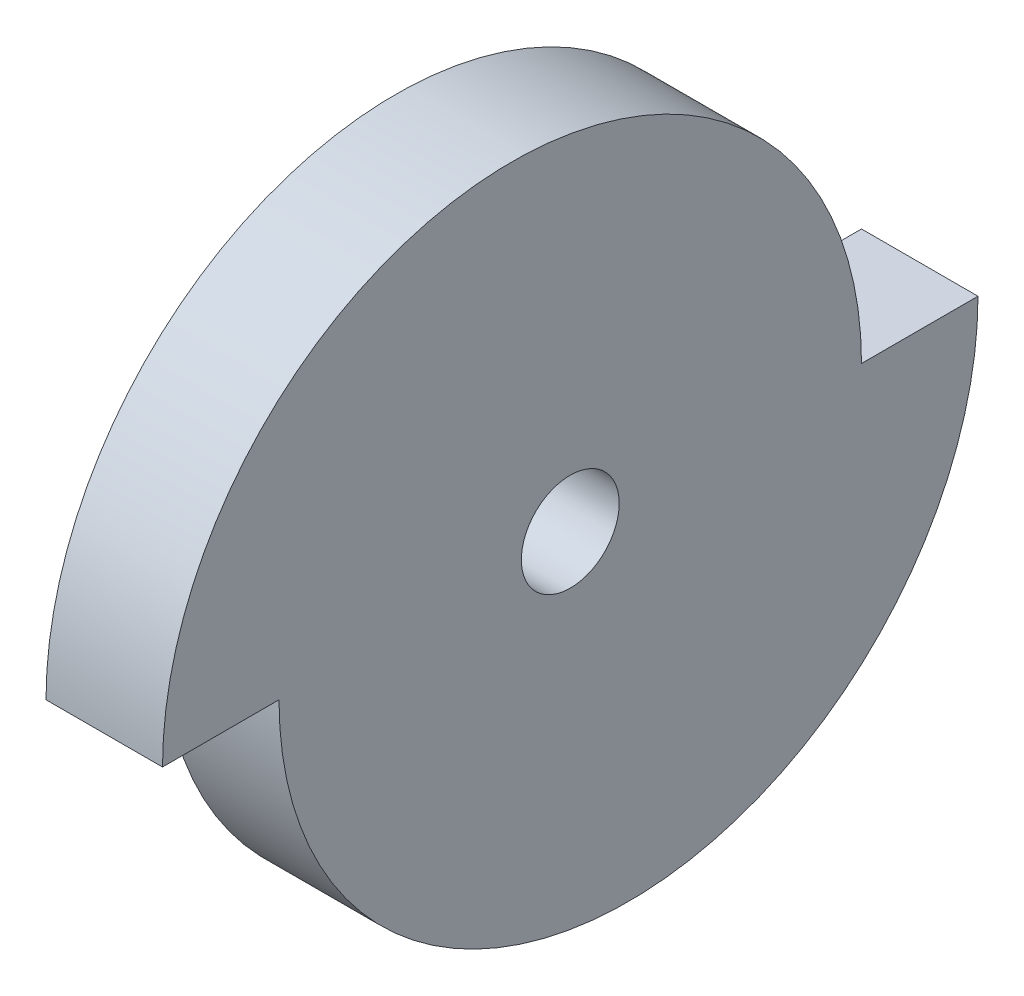
ISO-10303-21;
HEADER;
FILE_DESCRIPTION(('STEP AP214'),'2;1');
FILE_NAME('part.step','',(''),(''),'','','');
FILE_SCHEMA(('AUTOMOTIVE_DESIGN { 1 0 10303 214 1 1 1 1 }'));
ENDSEC;
DATA;
#1=APPLICATION_CONTEXT('core data for automotive mechanical design processes');
#2=APPLICATION_PROTOCOL_DEFINITION('international standard','automotive_design',2000,#1);
#3=PRODUCT_CONTEXT('',#1,'mechanical');
#4=PRODUCT('Part','Part','',(#3));
#5=PRODUCT_RELATED_PRODUCT_CATEGORY('part','',(#4));
#6=PRODUCT_DEFINITION_FORMATION('','',#4);
#7=PRODUCT_DEFINITION_CONTEXT('part definition',#1,'design');
#8=PRODUCT_DEFINITION('design','',#6,#7);
#9=PRODUCT_DEFINITION_SHAPE('','',#8);
#10=(LENGTH_UNIT() NAMED_UNIT(*) SI_UNIT(.MILLI.,.METRE.));
#11=(NAMED_UNIT(*) PLANE_ANGLE_UNIT() SI_UNIT($,.RADIAN.));
#12=(NAMED_UNIT(*) SI_UNIT($,.STERADIAN.) SOLID_ANGLE_UNIT());
#13=UNCERTAINTY_MEASURE_WITH_UNIT(LENGTH_MEASURE(1.E-05),#10,'distance_accuracy_value','');
#14=(GEOMETRIC_REPRESENTATION_CONTEXT(3) GLOBAL_UNCERTAINTY_ASSIGNED_CONTEXT((#13)) GLOBAL_UNIT_ASSIGNED_CONTEXT((#10,
#11,#12)) REPRESENTATION_CONTEXT('',''));
#15=CARTESIAN_POINT('',(0.,0.,0.));
#16=DIRECTION('',(0.,0.,1.));
#17=DIRECTION('',(1.,0.,0.));
#18=AXIS2_PLACEMENT_3D('',#15,#16,#17);
#19=CARTESIAN_POINT('',(5.,0.,-75.2866726083924));
#20=DIRECTION('',(0.,1.,0.));
#21=DIRECTION('',(0.,0.,1.));
#22=AXIS2_PLACEMENT_3D('',#19,#20,#21);
#23=PLANE('',#22);
#24=DIRECTION('',(0.,0.,-1.));
#25=VECTOR('',#24,1.);
#26=CARTESIAN_POINT('',(0.,0.,-75.2866726083924));
#27=LINE('',#26,#25);
#28=CARTESIAN_POINT('',(0.,0.,-75.2866726083924));
#29=VERTEX_POINT('',#28);
#30=CARTESIAN_POINT('',(0.,0.,-80.2866726083924));
#31=VERTEX_POINT('',#30);
#32=EDGE_CURVE('E123',#29,#31,#27,.T.);
#33=ORIENTED_EDGE('',*,*,#32,.F.);
#34=DIRECTION('',(-1.,0.,0.));
#35=VECTOR('',#34,1.);
#36=CARTESIAN_POINT('',(5.,0.,-75.2866726083924));
#37=LINE('',#36,#35);
#38=CARTESIAN_POINT('',(5.,0.,-75.2866726083924));
#39=VERTEX_POINT('',#38);
#40=EDGE_CURVE('E11',#39,#29,#37,.T.);
#41=ORIENTED_EDGE('',*,*,#40,.F.);
#42=DIRECTION('',(0.,0.,-1.));
#43=VECTOR('',#42,1.);
#44=CARTESIAN_POINT('',(5.,0.,-75.2866726083924));
#45=LINE('',#44,#43);
#46=CARTESIAN_POINT('',(5.,0.,-80.2866726083924));
#47=VERTEX_POINT('',#46);
#48=EDGE_CURVE('E113',#39,#47,#45,.T.);
#49=ORIENTED_EDGE('',*,*,#48,.T.);
#50=DIRECTION('',(-1.,0.,0.));
#51=VECTOR('',#50,1.);
#52=CARTESIAN_POINT('',(5.,0.,-80.2866726083924));
#53=LINE('',#52,#51);
#54=EDGE_CURVE('E109',#47,#31,#53,.T.);
#55=ORIENTED_EDGE('',*,*,#54,.T.);
#56=EDGE_LOOP('',(#33,#41,#49,#55));
#57=FACE_BOUND('',#56,.T.);
#58=ADVANCED_FACE('F52',(#57),#23,.T.);
#59=CARTESIAN_POINT('',(5.,0.,-60.2866726083924));
#60=DIRECTION('',(-1.,0.,0.));
#61=DIRECTION('',(0.,0.,1.));
#62=AXIS2_PLACEMENT_3D('',#59,#60,#61);
#63=CYLINDRICAL_SURFACE('',#62,15.);
#64=CARTESIAN_POINT('',(0.,0.,-60.2866726083924));
#65=DIRECTION('',(1.,0.,0.));
#66=DIRECTION('',(0.,0.,-1.));
#67=AXIS2_PLACEMENT_3D('',#64,#65,#66);
#68=CIRCLE('',#67,15.);
#69=CARTESIAN_POINT('',(0.,0.,-45.2866726083924));
#70=VERTEX_POINT('',#69);
#71=EDGE_CURVE('E132',#29,#70,#68,.T.);
#72=ORIENTED_EDGE('',*,*,#71,.T.);
#73=DIRECTION('',(-1.,0.,0.));
#74=VECTOR('',#73,1.);
#75=CARTESIAN_POINT('',(5.,0.,-45.2866726083924));
#76=LINE('',#75,#74);
#77=CARTESIAN_POINT('',(5.,0.,-45.2866726083924));
#78=VERTEX_POINT('',#77);
#79=EDGE_CURVE('E62',#78,#70,#76,.T.);
#80=ORIENTED_EDGE('',*,*,#79,.F.);
#81=CARTESIAN_POINT('',(5.,0.,-60.2866726083924));
#82=DIRECTION('',(1.,0.,0.));
#83=DIRECTION('',(0.,0.,-1.));
#84=AXIS2_PLACEMENT_3D('',#81,#82,#83);
#85=CIRCLE('',#84,15.);
#86=EDGE_CURVE('E116',#39,#78,#85,.T.);
#87=ORIENTED_EDGE('',*,*,#86,.F.);
#88=ORIENTED_EDGE('',*,*,#40,.T.);
#89=EDGE_LOOP('',(#72,#80,#87,#88));
#90=FACE_BOUND('',#89,.T.);
#91=ADVANCED_FACE('F139',(#90),#63,.T.);
#92=CARTESIAN_POINT('',(5.,0.,-50.2866726083924));
#93=DIRECTION('',(0.,-1.,0.));
#94=DIRECTION('',(0.,0.,-1.));
#95=AXIS2_PLACEMENT_3D('',#92,#93,#94);
#96=PLANE('',#95);
#97=DIRECTION('',(0.,0.,1.));
#98=VECTOR('',#97,1.);
#99=CARTESIAN_POINT('',(0.,0.,-50.2866726083924));
#100=LINE('',#99,#98);
#101=CARTESIAN_POINT('',(0.,0.,-50.2866726083924));
#102=VERTEX_POINT('',#101);
#103=EDGE_CURVE('E104',#102,#70,#100,.T.);
#104=ORIENTED_EDGE('',*,*,#103,.F.);
#105=DIRECTION('',(-1.,0.,0.));
#106=VECTOR('',#105,1.);
#107=CARTESIAN_POINT('',(5.,0.,-50.2866726083924));
#108=LINE('',#107,#106);
#109=CARTESIAN_POINT('',(5.,0.,-50.2866726083924));
#110=VERTEX_POINT('',#109);
#111=EDGE_CURVE('E100',#110,#102,#108,.T.);
#112=ORIENTED_EDGE('',*,*,#111,.F.);
#113=DIRECTION('',(0.,0.,1.));
#114=VECTOR('',#113,1.);
#115=CARTESIAN_POINT('',(5.,0.,-50.2866726083924));
#116=LINE('',#115,#114);
#117=EDGE_CURVE('E102',#110,#78,#116,.T.);
#118=ORIENTED_EDGE('',*,*,#117,.T.);
#119=ORIENTED_EDGE('',*,*,#79,.T.);
#120=EDGE_LOOP('',(#104,#112,#118,#119));
#121=FACE_BOUND('',#120,.T.);
#122=ADVANCED_FACE('F101',(#121),#96,.T.);
#123=CARTESIAN_POINT('',(5.,0.,-65.2866726083924));
#124=DIRECTION('',(-1.,0.,0.));
#125=DIRECTION('',(0.,0.,1.));
#126=AXIS2_PLACEMENT_3D('',#123,#124,#125);
#127=CYLINDRICAL_SURFACE('',#126,15.);
#128=CARTESIAN_POINT('',(0.,0.,-65.2866726083924));
#129=DIRECTION('',(1.,0.,0.));
#130=DIRECTION('',(0.,0.,-1.));
#131=AXIS2_PLACEMENT_3D('',#128,#129,#130);
#132=CIRCLE('',#131,15.);
#133=EDGE_CURVE('E127',#102,#31,#132,.T.);
#134=ORIENTED_EDGE('',*,*,#133,.T.);
#135=ORIENTED_EDGE('',*,*,#54,.F.);
#136=CARTESIAN_POINT('',(5.,0.,-65.2866726083924));
#137=DIRECTION('',(1.,0.,0.));
#138=DIRECTION('',(0.,0.,-1.));
#139=AXIS2_PLACEMENT_3D('',#136,#137,#138);
#140=CIRCLE('',#139,15.);
#141=EDGE_CURVE('E97',#110,#47,#140,.T.);
#142=ORIENTED_EDGE('',*,*,#141,.F.);
#143=ORIENTED_EDGE('',*,*,#111,.T.);
#144=EDGE_LOOP('',(#134,#135,#142,#143));
#145=FACE_BOUND('',#144,.T.);
#146=ADVANCED_FACE('F111',(#145),#127,.T.);
#147=CARTESIAN_POINT('',(5.,0.,-65.2866726083924));
#148=DIRECTION('',(1.,0.,0.));
#149=DIRECTION('',(0.,0.,-1.));
#150=AXIS2_PLACEMENT_3D('',#147,#148,#149);
#151=PLANE('',#150);
#152=CARTESIAN_POINT('',(5.,0.,-62.7866726083924));
#153=DIRECTION('',(1.,0.,0.));
#154=DIRECTION('',(0.,0.,-1.));
#155=AXIS2_PLACEMENT_3D('',#152,#153,#154);
#156=CIRCLE('',#155,2.1);
#157=CARTESIAN_POINT('',(5.,0.,-64.8866726083924));
#158=VERTEX_POINT('',#157);
#159=EDGE_CURVE('E142',#158,#158,#156,.T.);
#160=ORIENTED_EDGE('',*,*,#159,.F.);
#161=EDGE_LOOP('',(#160));
#162=FACE_BOUND('',#161,.T.);
#163=ORIENTED_EDGE('',*,*,#48,.F.);
#164=ORIENTED_EDGE('',*,*,#86,.T.);
#165=ORIENTED_EDGE('',*,*,#117,.F.);
#166=ORIENTED_EDGE('',*,*,#141,.T.);
#167=EDGE_LOOP('',(#163,#164,#165,#166));
#168=FACE_BOUND('',#167,.T.);
#169=ADVANCED_FACE('F115',(#162,#168),#151,.T.);
#170=CARTESIAN_POINT('',(0.,0.,-65.2866726083924));
#171=DIRECTION('',(1.,0.,0.));
#172=DIRECTION('',(0.,0.,-1.));
#173=AXIS2_PLACEMENT_3D('',#170,#171,#172);
#174=PLANE('',#173);
#175=CARTESIAN_POINT('',(0.,0.,-62.7866726083924));
#176=DIRECTION('',(1.,0.,0.));
#177=DIRECTION('',(0.,0.,-1.));
#178=AXIS2_PLACEMENT_3D('',#175,#176,#177);
#179=CIRCLE('',#178,2.1);
#180=CARTESIAN_POINT('',(0.,0.,-64.8866726083924));
#181=VERTEX_POINT('',#180);
#182=EDGE_CURVE('E55',#181,#181,#179,.T.);
#183=ORIENTED_EDGE('',*,*,#182,.T.);
#184=EDGE_LOOP('',(#183));
#185=FACE_BOUND('',#184,.T.);
#186=ORIENTED_EDGE('',*,*,#32,.T.);
#187=ORIENTED_EDGE('',*,*,#133,.F.);
#188=ORIENTED_EDGE('',*,*,#103,.T.);
#189=ORIENTED_EDGE('',*,*,#71,.F.);
#190=EDGE_LOOP('',(#186,#187,#188,#189));
#191=FACE_BOUND('',#190,.T.);
#192=ADVANCED_FACE('F138',(#185,#191),#174,.F.);
#193=CARTESIAN_POINT('',(5.,0.,-62.7866726083924));
#194=DIRECTION('',(1.,0.,0.));
#195=DIRECTION('',(0.,0.,-1.));
#196=AXIS2_PLACEMENT_3D('',#193,#194,#195);
#197=CYLINDRICAL_SURFACE('',#196,2.1);
#198=ORIENTED_EDGE('',*,*,#159,.T.);
#199=EDGE_LOOP('',(#198));
#200=FACE_BOUND('',#199,.T.);
#201=ORIENTED_EDGE('',*,*,#182,.F.);
#202=EDGE_LOOP('',(#201));
#203=FACE_BOUND('',#202,.T.);
#204=ADVANCED_FACE('F152',(#200,#203),#197,.F.);
#205=CLOSED_SHELL('',(#58,#91,#122,#146,#169,#192,#204));
#206=MANIFOLD_SOLID_BREP('B2',#205);
#207=ADVANCED_BREP_SHAPE_REPRESENTATION('',(#18,#206),#14);
#208=SHAPE_DEFINITION_REPRESENTATION(#9,#207);
ENDSEC;
END-ISO-10303-21;
